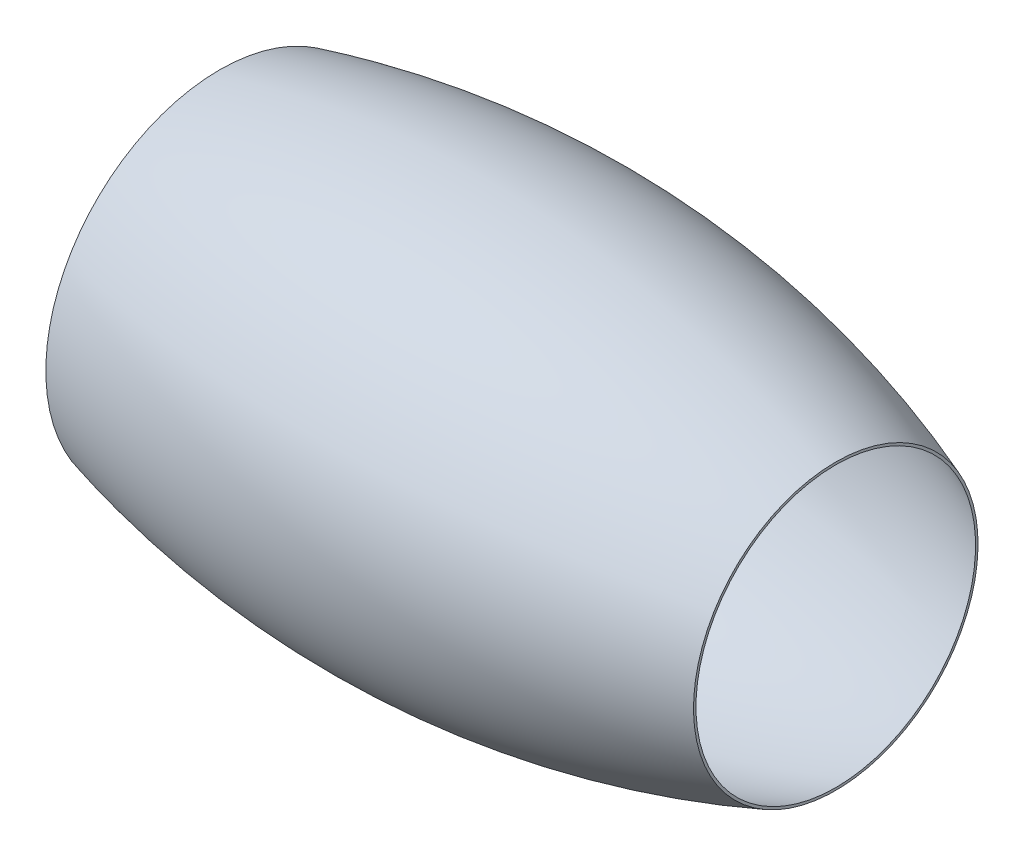
ISO-10303-21;
HEADER;
FILE_DESCRIPTION(('STEP AP214'),'2;1');
FILE_NAME('part.step','',(''),(''),'','','');
FILE_SCHEMA(('AUTOMOTIVE_DESIGN { 1 0 10303 214 1 1 1 1 }'));
ENDSEC;
DATA;
#1=APPLICATION_CONTEXT('core data for automotive mechanical design processes');
#2=APPLICATION_PROTOCOL_DEFINITION('international standard','automotive_design',2000,#1);
#3=PRODUCT_CONTEXT('',#1,'mechanical');
#4=PRODUCT('Part','Part','',(#3));
#5=PRODUCT_RELATED_PRODUCT_CATEGORY('part','',(#4));
#6=PRODUCT_DEFINITION_FORMATION('','',#4);
#7=PRODUCT_DEFINITION_CONTEXT('part definition',#1,'design');
#8=PRODUCT_DEFINITION('design','',#6,#7);
#9=PRODUCT_DEFINITION_SHAPE('','',#8);
#10=(LENGTH_UNIT() NAMED_UNIT(*) SI_UNIT(.MILLI.,.METRE.));
#11=(NAMED_UNIT(*) PLANE_ANGLE_UNIT() SI_UNIT($,.RADIAN.));
#12=(NAMED_UNIT(*) SI_UNIT($,.STERADIAN.) SOLID_ANGLE_UNIT());
#13=UNCERTAINTY_MEASURE_WITH_UNIT(LENGTH_MEASURE(1.E-05),#10,'distance_accuracy_value','');
#14=(GEOMETRIC_REPRESENTATION_CONTEXT(3) GLOBAL_UNCERTAINTY_ASSIGNED_CONTEXT((#13)) GLOBAL_UNIT_ASSIGNED_CONTEXT((#10,
#11,#12)) REPRESENTATION_CONTEXT('',''));
#15=CARTESIAN_POINT('',(0.,0.,0.));
#16=DIRECTION('',(0.,0.,1.));
#17=DIRECTION('',(1.,0.,0.));
#18=AXIS2_PLACEMENT_3D('',#15,#16,#17);
#19=CARTESIAN_POINT('',(-2.53666651734985,1.62013653998116E-13,0.));
#20=DIRECTION('',(-1.,0.,0.));
#21=DIRECTION('',(0.,-1.,0.));
#22=AXIS2_PLACEMENT_3D('',#19,#20,#21);
#23=CONICAL_SURFACE('',#22,281.508969578448,1.31320026109043);
#24=CARTESIAN_POINT('',(-1.77239649745786,1.62247644206502E-13,0.));
#25=DIRECTION('',(1.,0.,0.));
#26=DIRECTION('',(0.,1.,0.));
#27=AXIS2_PLACEMENT_3D('',#24,#25,#26);
#28=CIRCLE('',#27,278.607954008567);
#29=CARTESIAN_POINT('',(-1.77239649745795,278.607954008567,0.));
#30=VERTEX_POINT('',#29);
#31=EDGE_CURVE('E10',#30,#30,#28,.T.);
#32=ORIENTED_EDGE('',*,*,#31,.T.);
#33=EDGE_LOOP('',(#32));
#34=FACE_BOUND('',#33,.T.);
#35=CARTESIAN_POINT('',(-2.53666651734985,1.62013653998116E-13,0.));
#36=DIRECTION('',(1.,0.,0.));
#37=DIRECTION('',(0.,1.,0.));
#38=AXIS2_PLACEMENT_3D('',#35,#36,#37);
#39=CIRCLE('',#38,281.508969578448);
#40=CARTESIAN_POINT('',(-2.53666651734994,281.508969578448,0.));
#41=VERTEX_POINT('',#40);
#42=EDGE_CURVE('E61',#41,#41,#39,.T.);
#43=ORIENTED_EDGE('',*,*,#42,.F.);
#44=EDGE_LOOP('',(#43));
#45=FACE_BOUND('',#44,.T.);
#46=ADVANCED_FACE('F39',(#34,#45),#23,.F.);
#47=CARTESIAN_POINT('',(415.262964630409,2.22044604925031E-13,0.));
#48=DIRECTION('',(1.,0.,0.));
#49=DIRECTION('',(0.,1.,0.));
#50=AXIS2_PLACEMENT_3D('',#47,#48,#49);
#51=DEGENERATE_TOROIDAL_SURFACE('',#50,1313.68520604989,1646.,.F.);
#52=CARTESIAN_POINT('',(994.577297146884,4.67291759994749E-13,0.));
#53=DIRECTION('',(1.,0.,0.));
#54=DIRECTION('',(0.,1.,0.));
#55=AXIS2_PLACEMENT_3D('',#52,#53,#54);
#56=CIRCLE('',#55,226.999999999999);
#57=CARTESIAN_POINT('',(994.577297146883,227.,0.));
#58=VERTEX_POINT('',#57);
#59=EDGE_CURVE('E45',#58,#58,#56,.T.);
#60=ORIENTED_EDGE('',*,*,#59,.T.);
#61=EDGE_LOOP('',(#60));
#62=FACE_BOUND('',#61,.T.);
#63=ORIENTED_EDGE('',*,*,#31,.F.);
#64=EDGE_LOOP('',(#63));
#65=FACE_BOUND('',#64,.T.);
#66=ADVANCED_FACE('F69',(#62,#65),#51,.T.);
#67=CARTESIAN_POINT('',(994.577297146884,0.,0.));
#68=DIRECTION('',(1.,0.,0.));
#69=DIRECTION('',(0.,1.,0.));
#70=AXIS2_PLACEMENT_3D('',#67,#68,#69);
#71=PLANE('',#70);
#72=CARTESIAN_POINT('',(994.577297146884,4.67291759994749E-13,0.));
#73=DIRECTION('',(1.,0.,0.));
#74=DIRECTION('',(0.,1.,0.));
#75=AXIS2_PLACEMENT_3D('',#72,#73,#74);
#76=CIRCLE('',#75,230.999999999999);
#77=CARTESIAN_POINT('',(994.577297146883,231.,0.));
#78=VERTEX_POINT('',#77);
#79=EDGE_CURVE('E49',#78,#78,#76,.T.);
#80=ORIENTED_EDGE('',*,*,#79,.T.);
#81=EDGE_LOOP('',(#80));
#82=FACE_BOUND('',#81,.T.);
#83=ORIENTED_EDGE('',*,*,#59,.F.);
#84=EDGE_LOOP('',(#83));
#85=FACE_BOUND('',#84,.T.);
#86=ADVANCED_FACE('F73',(#82,#85),#71,.T.);
#87=CARTESIAN_POINT('',(414.029441715859,2.22044604925031E-13,0.));
#88=DIRECTION('',(1.,0.,0.));
#89=DIRECTION('',(0.,1.,0.));
#90=AXIS2_PLACEMENT_3D('',#87,#88,#89);
#91=DEGENERATE_TOROIDAL_SURFACE('',#90,1313.49480010599,1650.,.F.);
#92=ORIENTED_EDGE('',*,*,#79,.F.);
#93=EDGE_LOOP('',(#92));
#94=FACE_BOUND('',#93,.T.);
#95=CARTESIAN_POINT('',(-5.81981709723145,1.61008479035923E-13,0.));
#96=DIRECTION('',(1.,0.,0.));
#97=DIRECTION('',(0.,1.,0.));
#98=AXIS2_PLACEMENT_3D('',#95,#96,#97);
#99=CIRCLE('',#98,282.195207343483);
#100=CARTESIAN_POINT('',(-5.81981709723154,282.195207343483,0.));
#101=VERTEX_POINT('',#100);
#102=EDGE_CURVE('E53',#101,#101,#99,.T.);
#103=ORIENTED_EDGE('',*,*,#102,.T.);
#104=EDGE_LOOP('',(#103));
#105=FACE_BOUND('',#104,.T.);
#106=ADVANCED_FACE('F77',(#94,#105),#91,.F.);
#107=CARTESIAN_POINT('',(-5.81981709723145,1.61008479035923E-13,0.));
#108=DIRECTION('',(-1.,0.,0.));
#109=DIRECTION('',(0.,-1.,0.));
#110=AXIS2_PLACEMENT_3D('',#107,#108,#109);
#111=CONICAL_SURFACE('',#110,282.195207343483,1.31320026105311);
#112=CARTESIAN_POINT('',(-5.43768208723128,1.61125474140133E-13,0.));
#113=DIRECTION('',(1.,0.,0.));
#114=DIRECTION('',(0.,1.,0.));
#115=AXIS2_PLACEMENT_3D('',#112,#113,#114);
#116=CIRCLE('',#115,280.744699558556);
#117=CARTESIAN_POINT('',(-5.43768208723136,280.744699558556,0.));
#118=VERTEX_POINT('',#117);
#119=EDGE_CURVE('E58',#118,#118,#116,.T.);
#120=ORIENTED_EDGE('',*,*,#119,.T.);
#121=EDGE_LOOP('',(#120));
#122=FACE_BOUND('',#121,.T.);
#123=ORIENTED_EDGE('',*,*,#102,.F.);
#124=EDGE_LOOP('',(#123));
#125=FACE_BOUND('',#124,.T.);
#126=ADVANCED_FACE('F84',(#122,#125),#111,.F.);
#127=CARTESIAN_POINT('',(-5.43768208723128,1.61125474140133E-13,0.));
#128=DIRECTION('',(1.,0.,0.));
#129=DIRECTION('',(0.,1.,0.));
#130=AXIS2_PLACEMENT_3D('',#127,#128,#129);
#131=CONICAL_SURFACE('',#130,280.744699558556,0.257596065704479);
#132=ORIENTED_EDGE('',*,*,#42,.T.);
#133=EDGE_LOOP('',(#132));
#134=FACE_BOUND('',#133,.T.);
#135=ORIENTED_EDGE('',*,*,#119,.F.);
#136=EDGE_LOOP('',(#135));
#137=FACE_BOUND('',#136,.T.);
#138=ADVANCED_FACE('F65',(#134,#137),#131,.F.);
#139=CLOSED_SHELL('',(#46,#66,#86,#106,#126,#138));
#140=MANIFOLD_SOLID_BREP('B2',#139);
#141=ADVANCED_BREP_SHAPE_REPRESENTATION('',(#18,#140),#14);
#142=SHAPE_DEFINITION_REPRESENTATION(#9,#141);
ENDSEC;
END-ISO-10303-21;
